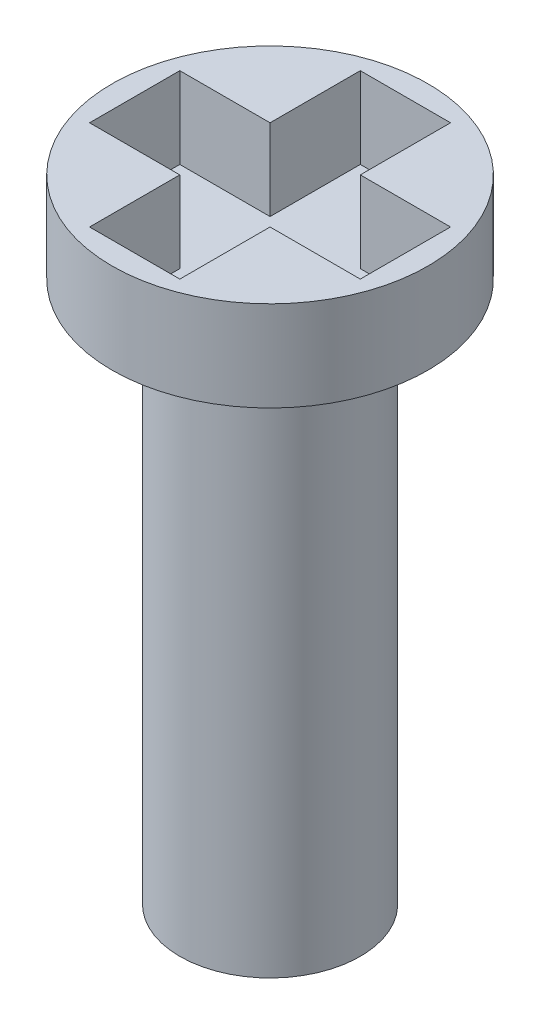
ISO-10303-21;
HEADER;
FILE_DESCRIPTION(('STEP AP214'),'2;1');
FILE_NAME('part.step','',(''),(''),'','','');
FILE_SCHEMA(('AUTOMOTIVE_DESIGN { 1 0 10303 214 1 1 1 1 }'));
ENDSEC;
DATA;
#1=APPLICATION_CONTEXT('core data for automotive mechanical design processes');
#2=APPLICATION_PROTOCOL_DEFINITION('international standard','automotive_design',2000,#1);
#3=PRODUCT_CONTEXT('',#1,'mechanical');
#4=PRODUCT('Part','Part','',(#3));
#5=PRODUCT_RELATED_PRODUCT_CATEGORY('part','',(#4));
#6=PRODUCT_DEFINITION_FORMATION('','',#4);
#7=PRODUCT_DEFINITION_CONTEXT('part definition',#1,'design');
#8=PRODUCT_DEFINITION('design','',#6,#7);
#9=PRODUCT_DEFINITION_SHAPE('','',#8);
#10=(LENGTH_UNIT() NAMED_UNIT(*) SI_UNIT(.MILLI.,.METRE.));
#11=(NAMED_UNIT(*) PLANE_ANGLE_UNIT() SI_UNIT($,.RADIAN.));
#12=(NAMED_UNIT(*) SI_UNIT($,.STERADIAN.) SOLID_ANGLE_UNIT());
#13=UNCERTAINTY_MEASURE_WITH_UNIT(LENGTH_MEASURE(1.E-05),#10,'distance_accuracy_value','');
#14=(GEOMETRIC_REPRESENTATION_CONTEXT(3) GLOBAL_UNCERTAINTY_ASSIGNED_CONTEXT((#13)) GLOBAL_UNIT_ASSIGNED_CONTEXT((#10,
#11,#12)) REPRESENTATION_CONTEXT('',''));
#15=CARTESIAN_POINT('',(0.,0.,0.));
#16=DIRECTION('',(0.,0.,1.));
#17=DIRECTION('',(1.,0.,0.));
#18=AXIS2_PLACEMENT_3D('',#15,#16,#17);
#19=CARTESIAN_POINT('',(0.,1.,1.5));
#20=DIRECTION('',(0.,0.,1.));
#21=DIRECTION('',(1.,0.,0.));
#22=AXIS2_PLACEMENT_3D('',#19,#20,#21);
#23=PLANE('',#22);
#24=DIRECTION('',(1.,0.,0.));
#25=VECTOR('',#24,1.);
#26=CARTESIAN_POINT('',(0.,0.1,1.5));
#27=LINE('',#26,#25);
#28=CARTESIAN_POINT('',(-0.5,0.1,1.5));
#29=VERTEX_POINT('',#28);
#30=CARTESIAN_POINT('',(0.5,0.1,1.5));
#31=VERTEX_POINT('',#30);
#32=EDGE_CURVE('E57',#29,#31,#27,.T.);
#33=ORIENTED_EDGE('',*,*,#32,.F.);
#34=DIRECTION('',(0.,-1.,0.));
#35=VECTOR('',#34,1.);
#36=CARTESIAN_POINT('',(-0.5,1.,1.5));
#37=LINE('',#36,#35);
#38=CARTESIAN_POINT('',(-0.5,1.,1.5));
#39=VERTEX_POINT('',#38);
#40=EDGE_CURVE('E44',#39,#29,#37,.T.);
#41=ORIENTED_EDGE('',*,*,#40,.F.);
#42=DIRECTION('',(-1.,0.,0.));
#43=VECTOR('',#42,1.);
#44=CARTESIAN_POINT('',(0.,1.,1.5));
#45=LINE('',#44,#43);
#46=CARTESIAN_POINT('',(0.5,1.,1.5));
#47=VERTEX_POINT('',#46);
#48=EDGE_CURVE('E204',#47,#39,#45,.T.);
#49=ORIENTED_EDGE('',*,*,#48,.F.);
#50=DIRECTION('',(0.,-1.,0.));
#51=VECTOR('',#50,1.);
#52=CARTESIAN_POINT('',(0.5,1.,1.5));
#53=LINE('',#52,#51);
#54=EDGE_CURVE('E64',#47,#31,#53,.T.);
#55=ORIENTED_EDGE('',*,*,#54,.T.);
#56=EDGE_LOOP('',(#33,#41,#49,#55));
#57=FACE_BOUND('',#56,.T.);
#58=ADVANCED_FACE('F41',(#57),#23,.F.);
#59=CARTESIAN_POINT('',(-0.5,1.,0.));
#60=DIRECTION('',(-1.,0.,0.));
#61=DIRECTION('',(0.,0.,1.));
#62=AXIS2_PLACEMENT_3D('',#59,#60,#61);
#63=PLANE('',#62);
#64=DIRECTION('',(0.,0.,1.));
#65=VECTOR('',#64,1.);
#66=CARTESIAN_POINT('',(-0.5,0.1,0.));
#67=LINE('',#66,#65);
#68=CARTESIAN_POINT('',(-0.5,0.1,0.5));
#69=VERTEX_POINT('',#68);
#70=EDGE_CURVE('E200',#69,#29,#67,.T.);
#71=ORIENTED_EDGE('',*,*,#70,.F.);
#72=DIRECTION('',(0.,-1.,0.));
#73=VECTOR('',#72,1.);
#74=CARTESIAN_POINT('',(-0.5,1.,0.5));
#75=LINE('',#74,#73);
#76=CARTESIAN_POINT('',(-0.5,1.,0.5));
#77=VERTEX_POINT('',#76);
#78=EDGE_CURVE('E187',#77,#69,#75,.T.);
#79=ORIENTED_EDGE('',*,*,#78,.F.);
#80=DIRECTION('',(0.,0.,-1.));
#81=VECTOR('',#80,1.);
#82=CARTESIAN_POINT('',(-0.5,1.,0.));
#83=LINE('',#82,#81);
#84=EDGE_CURVE('E201',#39,#77,#83,.T.);
#85=ORIENTED_EDGE('',*,*,#84,.F.);
#86=ORIENTED_EDGE('',*,*,#40,.T.);
#87=EDGE_LOOP('',(#71,#79,#85,#86));
#88=FACE_BOUND('',#87,.T.);
#89=ADVANCED_FACE('F199',(#88),#63,.F.);
#90=CARTESIAN_POINT('',(0.,1.,0.5));
#91=DIRECTION('',(0.,0.,-1.));
#92=DIRECTION('',(-1.,0.,0.));
#93=AXIS2_PLACEMENT_3D('',#90,#91,#92);
#94=PLANE('',#93);
#95=ORIENTED_EDGE('',*,*,#78,.T.);
#96=DIRECTION('',(-1.,0.,0.));
#97=VECTOR('',#96,1.);
#98=CARTESIAN_POINT('',(0.,0.1,0.5));
#99=LINE('',#98,#97);
#100=CARTESIAN_POINT('',(-1.5,0.1,0.5));
#101=VERTEX_POINT('',#100);
#102=EDGE_CURVE('E211',#69,#101,#99,.T.);
#103=ORIENTED_EDGE('',*,*,#102,.T.);
#104=DIRECTION('',(0.,-1.,0.));
#105=VECTOR('',#104,1.);
#106=CARTESIAN_POINT('',(-1.5,1.,0.5));
#107=LINE('',#106,#105);
#108=CARTESIAN_POINT('',(-1.5,1.,0.5));
#109=VERTEX_POINT('',#108);
#110=EDGE_CURVE('E184',#109,#101,#107,.T.);
#111=ORIENTED_EDGE('',*,*,#110,.F.);
#112=DIRECTION('',(1.,0.,0.));
#113=VECTOR('',#112,1.);
#114=CARTESIAN_POINT('',(0.,1.,0.5));
#115=LINE('',#114,#113);
#116=EDGE_CURVE('E219',#109,#77,#115,.T.);
#117=ORIENTED_EDGE('',*,*,#116,.T.);
#118=EDGE_LOOP('',(#95,#103,#111,#117));
#119=FACE_BOUND('',#118,.T.);
#120=ADVANCED_FACE('F281',(#119),#94,.T.);
#121=CARTESIAN_POINT('',(-1.5,1.,0.));
#122=DIRECTION('',(-1.,0.,0.));
#123=DIRECTION('',(0.,0.,1.));
#124=AXIS2_PLACEMENT_3D('',#121,#122,#123);
#125=PLANE('',#124);
#126=DIRECTION('',(0.,0.,1.));
#127=VECTOR('',#126,1.);
#128=CARTESIAN_POINT('',(-1.5,0.1,0.));
#129=LINE('',#128,#127);
#130=CARTESIAN_POINT('',(-1.5,0.1,-0.5));
#131=VERTEX_POINT('',#130);
#132=EDGE_CURVE('E278',#131,#101,#129,.T.);
#133=ORIENTED_EDGE('',*,*,#132,.F.);
#134=DIRECTION('',(0.,-1.,0.));
#135=VECTOR('',#134,1.);
#136=CARTESIAN_POINT('',(-1.5,1.,-0.5));
#137=LINE('',#136,#135);
#138=CARTESIAN_POINT('',(-1.5,1.,-0.5));
#139=VERTEX_POINT('',#138);
#140=EDGE_CURVE('E180',#139,#131,#137,.T.);
#141=ORIENTED_EDGE('',*,*,#140,.F.);
#142=DIRECTION('',(0.,0.,-1.));
#143=VECTOR('',#142,1.);
#144=CARTESIAN_POINT('',(-1.5,1.,0.));
#145=LINE('',#144,#143);
#146=EDGE_CURVE('E223',#109,#139,#145,.T.);
#147=ORIENTED_EDGE('',*,*,#146,.F.);
#148=ORIENTED_EDGE('',*,*,#110,.T.);
#149=EDGE_LOOP('',(#133,#141,#147,#148));
#150=FACE_BOUND('',#149,.T.);
#151=ADVANCED_FACE('F285',(#150),#125,.F.);
#152=CARTESIAN_POINT('',(0.,1.,-0.5));
#153=DIRECTION('',(0.,0.,-1.));
#154=DIRECTION('',(-1.,0.,0.));
#155=AXIS2_PLACEMENT_3D('',#152,#153,#154);
#156=PLANE('',#155);
#157=DIRECTION('',(-1.,0.,0.));
#158=VECTOR('',#157,1.);
#159=CARTESIAN_POINT('',(0.,0.1,-0.5));
#160=LINE('',#159,#158);
#161=CARTESIAN_POINT('',(-0.5,0.1,-0.5));
#162=VERTEX_POINT('',#161);
#163=EDGE_CURVE('E275',#162,#131,#160,.T.);
#164=ORIENTED_EDGE('',*,*,#163,.F.);
#165=DIRECTION('',(0.,-1.,0.));
#166=VECTOR('',#165,1.);
#167=CARTESIAN_POINT('',(-0.5,1.,-0.5));
#168=LINE('',#167,#166);
#169=CARTESIAN_POINT('',(-0.5,1.,-0.5));
#170=VERTEX_POINT('',#169);
#171=EDGE_CURVE('E176',#170,#162,#168,.T.);
#172=ORIENTED_EDGE('',*,*,#171,.F.);
#173=DIRECTION('',(1.,0.,0.));
#174=VECTOR('',#173,1.);
#175=CARTESIAN_POINT('',(0.,1.,-0.5));
#176=LINE('',#175,#174);
#177=EDGE_CURVE('E227',#139,#170,#176,.T.);
#178=ORIENTED_EDGE('',*,*,#177,.F.);
#179=ORIENTED_EDGE('',*,*,#140,.T.);
#180=EDGE_LOOP('',(#164,#172,#178,#179));
#181=FACE_BOUND('',#180,.T.);
#182=ADVANCED_FACE('F295',(#181),#156,.F.);
#183=DIRECTION('',(0.,0.,1.));
#184=VECTOR('',#183,1.);
#185=CARTESIAN_POINT('',(-0.5,0.1,0.));
#186=LINE('',#185,#184);
#187=CARTESIAN_POINT('',(-0.5,0.1,-1.5));
#188=VERTEX_POINT('',#187);
#189=EDGE_CURVE('E272',#188,#162,#186,.T.);
#190=ORIENTED_EDGE('',*,*,#189,.F.);
#191=DIRECTION('',(0.,-1.,0.));
#192=VECTOR('',#191,1.);
#193=CARTESIAN_POINT('',(-0.5,1.,-1.5));
#194=LINE('',#193,#192);
#195=CARTESIAN_POINT('',(-0.5,1.,-1.5));
#196=VERTEX_POINT('',#195);
#197=EDGE_CURVE('E172',#196,#188,#194,.T.);
#198=ORIENTED_EDGE('',*,*,#197,.F.);
#199=EDGE_CURVE('E220',#170,#196,#83,.T.);
#200=ORIENTED_EDGE('',*,*,#199,.F.);
#201=ORIENTED_EDGE('',*,*,#171,.T.);
#202=EDGE_LOOP('',(#190,#198,#200,#201));
#203=FACE_BOUND('',#202,.T.);
#204=ADVANCED_FACE('F298',(#203),#63,.F.);
#205=CARTESIAN_POINT('',(0.,1.,-1.5));
#206=DIRECTION('',(0.,0.,1.));
#207=DIRECTION('',(1.,0.,0.));
#208=AXIS2_PLACEMENT_3D('',#205,#206,#207);
#209=PLANE('',#208);
#210=ORIENTED_EDGE('',*,*,#197,.T.);
#211=DIRECTION('',(1.,0.,0.));
#212=VECTOR('',#211,1.);
#213=CARTESIAN_POINT('',(0.,0.1,-1.5));
#214=LINE('',#213,#212);
#215=CARTESIAN_POINT('',(0.5,0.1,-1.5));
#216=VERTEX_POINT('',#215);
#217=EDGE_CURVE('E268',#188,#216,#214,.T.);
#218=ORIENTED_EDGE('',*,*,#217,.T.);
#219=DIRECTION('',(0.,-1.,0.));
#220=VECTOR('',#219,1.);
#221=CARTESIAN_POINT('',(0.5,1.,-1.5));
#222=LINE('',#221,#220);
#223=CARTESIAN_POINT('',(0.5,1.,-1.5));
#224=VERTEX_POINT('',#223);
#225=EDGE_CURVE('E168',#224,#216,#222,.T.);
#226=ORIENTED_EDGE('',*,*,#225,.F.);
#227=DIRECTION('',(-1.,0.,0.));
#228=VECTOR('',#227,1.);
#229=CARTESIAN_POINT('',(0.,1.,-1.5));
#230=LINE('',#229,#228);
#231=EDGE_CURVE('E231',#224,#196,#230,.T.);
#232=ORIENTED_EDGE('',*,*,#231,.T.);
#233=EDGE_LOOP('',(#210,#218,#226,#232));
#234=FACE_BOUND('',#233,.T.);
#235=ADVANCED_FACE('F302',(#234),#209,.T.);
#236=CARTESIAN_POINT('',(0.5,1.,0.));
#237=DIRECTION('',(-1.,0.,0.));
#238=DIRECTION('',(0.,0.,1.));
#239=AXIS2_PLACEMENT_3D('',#236,#237,#238);
#240=PLANE('',#239);
#241=ORIENTED_EDGE('',*,*,#225,.T.);
#242=DIRECTION('',(0.,0.,1.));
#243=VECTOR('',#242,1.);
#244=CARTESIAN_POINT('',(0.5,0.1,0.));
#245=LINE('',#244,#243);
#246=CARTESIAN_POINT('',(0.5,0.1,-0.5));
#247=VERTEX_POINT('',#246);
#248=EDGE_CURVE('E262',#216,#247,#245,.T.);
#249=ORIENTED_EDGE('',*,*,#248,.T.);
#250=DIRECTION('',(0.,-1.,0.));
#251=VECTOR('',#250,1.);
#252=CARTESIAN_POINT('',(0.5,1.,-0.5));
#253=LINE('',#252,#251);
#254=CARTESIAN_POINT('',(0.5,1.,-0.5));
#255=VERTEX_POINT('',#254);
#256=EDGE_CURVE('E164',#255,#247,#253,.T.);
#257=ORIENTED_EDGE('',*,*,#256,.F.);
#258=DIRECTION('',(0.,0.,-1.));
#259=VECTOR('',#258,1.);
#260=CARTESIAN_POINT('',(0.5,1.,0.));
#261=LINE('',#260,#259);
#262=EDGE_CURVE('E235',#255,#224,#261,.T.);
#263=ORIENTED_EDGE('',*,*,#262,.T.);
#264=EDGE_LOOP('',(#241,#249,#257,#263));
#265=FACE_BOUND('',#264,.T.);
#266=ADVANCED_FACE('F304',(#265),#240,.T.);
#267=DIRECTION('',(-1.,0.,0.));
#268=VECTOR('',#267,1.);
#269=CARTESIAN_POINT('',(0.,0.1,-0.5));
#270=LINE('',#269,#268);
#271=CARTESIAN_POINT('',(1.5,0.1,-0.5));
#272=VERTEX_POINT('',#271);
#273=EDGE_CURVE('E259',#272,#247,#270,.T.);
#274=ORIENTED_EDGE('',*,*,#273,.F.);
#275=DIRECTION('',(0.,-1.,0.));
#276=VECTOR('',#275,1.);
#277=CARTESIAN_POINT('',(1.5,1.,-0.5));
#278=LINE('',#277,#276);
#279=CARTESIAN_POINT('',(1.5,1.,-0.5));
#280=VERTEX_POINT('',#279);
#281=EDGE_CURVE('E155',#280,#272,#278,.T.);
#282=ORIENTED_EDGE('',*,*,#281,.F.);
#283=EDGE_CURVE('E230',#255,#280,#176,.T.);
#284=ORIENTED_EDGE('',*,*,#283,.F.);
#285=ORIENTED_EDGE('',*,*,#256,.T.);
#286=EDGE_LOOP('',(#274,#282,#284,#285));
#287=FACE_BOUND('',#286,.T.);
#288=ADVANCED_FACE('F306',(#287),#156,.F.);
#289=CARTESIAN_POINT('',(1.5,1.,0.));
#290=DIRECTION('',(-1.,0.,0.));
#291=DIRECTION('',(0.,0.,1.));
#292=AXIS2_PLACEMENT_3D('',#289,#290,#291);
#293=PLANE('',#292);
#294=ORIENTED_EDGE('',*,*,#281,.T.);
#295=DIRECTION('',(0.,0.,1.));
#296=VECTOR('',#295,1.);
#297=CARTESIAN_POINT('',(1.5,0.1,0.));
#298=LINE('',#297,#296);
#299=CARTESIAN_POINT('',(1.5,0.1,0.5));
#300=VERTEX_POINT('',#299);
#301=EDGE_CURVE('E146',#272,#300,#298,.T.);
#302=ORIENTED_EDGE('',*,*,#301,.T.);
#303=DIRECTION('',(0.,-1.,0.));
#304=VECTOR('',#303,1.);
#305=CARTESIAN_POINT('',(1.5,1.,0.5));
#306=LINE('',#305,#304);
#307=CARTESIAN_POINT('',(1.5,1.,0.5));
#308=VERTEX_POINT('',#307);
#309=EDGE_CURVE('E144',#308,#300,#306,.T.);
#310=ORIENTED_EDGE('',*,*,#309,.F.);
#311=DIRECTION('',(0.,0.,-1.));
#312=VECTOR('',#311,1.);
#313=CARTESIAN_POINT('',(1.5,1.,0.));
#314=LINE('',#313,#312);
#315=EDGE_CURVE('E239',#308,#280,#314,.T.);
#316=ORIENTED_EDGE('',*,*,#315,.T.);
#317=EDGE_LOOP('',(#294,#302,#310,#316));
#318=FACE_BOUND('',#317,.T.);
#319=ADVANCED_FACE('F256',(#318),#293,.T.);
#320=ORIENTED_EDGE('',*,*,#309,.T.);
#321=DIRECTION('',(-1.,0.,0.));
#322=VECTOR('',#321,1.);
#323=CARTESIAN_POINT('',(0.,0.1,0.5));
#324=LINE('',#323,#322);
#325=CARTESIAN_POINT('',(0.5,0.1,0.5));
#326=VERTEX_POINT('',#325);
#327=EDGE_CURVE('E132',#300,#326,#324,.T.);
#328=ORIENTED_EDGE('',*,*,#327,.T.);
#329=DIRECTION('',(0.,-1.,0.));
#330=VECTOR('',#329,1.);
#331=CARTESIAN_POINT('',(0.5,1.,0.5));
#332=LINE('',#331,#330);
#333=CARTESIAN_POINT('',(0.5,1.,0.5));
#334=VERTEX_POINT('',#333);
#335=EDGE_CURVE('E142',#334,#326,#332,.T.);
#336=ORIENTED_EDGE('',*,*,#335,.F.);
#337=EDGE_CURVE('E224',#334,#308,#115,.T.);
#338=ORIENTED_EDGE('',*,*,#337,.T.);
#339=EDGE_LOOP('',(#320,#328,#336,#338));
#340=FACE_BOUND('',#339,.T.);
#341=ADVANCED_FACE('F140',(#340),#94,.T.);
#342=ORIENTED_EDGE('',*,*,#335,.T.);
#343=DIRECTION('',(0.,0.,1.));
#344=VECTOR('',#343,1.);
#345=CARTESIAN_POINT('',(0.5,0.1,0.));
#346=LINE('',#345,#344);
#347=EDGE_CURVE('E129',#326,#31,#346,.T.);
#348=ORIENTED_EDGE('',*,*,#347,.T.);
#349=ORIENTED_EDGE('',*,*,#54,.F.);
#350=EDGE_CURVE('E150',#47,#334,#261,.T.);
#351=ORIENTED_EDGE('',*,*,#350,.T.);
#352=EDGE_LOOP('',(#342,#348,#349,#351));
#353=FACE_BOUND('',#352,.T.);
#354=ADVANCED_FACE('F148',(#353),#240,.T.);
#355=CARTESIAN_POINT('',(0.,1.,0.));
#356=DIRECTION('',(0.,-1.,0.));
#357=DIRECTION('',(0.,0.,-1.));
#358=AXIS2_PLACEMENT_3D('',#355,#356,#357);
#359=CYLINDRICAL_SURFACE('',#358,1.75);
#360=CARTESIAN_POINT('',(0.,0.,0.));
#361=DIRECTION('',(0.,1.,0.));
#362=DIRECTION('',(0.,0.,1.));
#363=AXIS2_PLACEMENT_3D('',#360,#361,#362);
#364=CIRCLE('',#363,1.75);
#365=CARTESIAN_POINT('',(0.,0.,1.75));
#366=VERTEX_POINT('',#365);
#367=EDGE_CURVE('E206',#366,#366,#364,.T.);
#368=ORIENTED_EDGE('',*,*,#367,.T.);
#369=EDGE_LOOP('',(#368));
#370=FACE_BOUND('',#369,.T.);
#371=CARTESIAN_POINT('',(0.,1.,0.));
#372=DIRECTION('',(0.,1.,0.));
#373=DIRECTION('',(0.,0.,1.));
#374=AXIS2_PLACEMENT_3D('',#371,#372,#373);
#375=CIRCLE('',#374,1.75);
#376=CARTESIAN_POINT('',(0.,1.,1.75));
#377=VERTEX_POINT('',#376);
#378=EDGE_CURVE('E157',#377,#377,#375,.T.);
#379=ORIENTED_EDGE('',*,*,#378,.F.);
#380=EDGE_LOOP('',(#379));
#381=FACE_BOUND('',#380,.T.);
#382=ADVANCED_FACE('F362',(#370,#381),#359,.T.);
#383=CARTESIAN_POINT('',(0.,1.,0.));
#384=DIRECTION('',(0.,1.,0.));
#385=DIRECTION('',(0.,0.,1.));
#386=AXIS2_PLACEMENT_3D('',#383,#384,#385);
#387=PLANE('',#386);
#388=ORIENTED_EDGE('',*,*,#48,.T.);
#389=ORIENTED_EDGE('',*,*,#84,.T.);
#390=ORIENTED_EDGE('',*,*,#116,.F.);
#391=ORIENTED_EDGE('',*,*,#146,.T.);
#392=ORIENTED_EDGE('',*,*,#177,.T.);
#393=ORIENTED_EDGE('',*,*,#199,.T.);
#394=ORIENTED_EDGE('',*,*,#231,.F.);
#395=ORIENTED_EDGE('',*,*,#262,.F.);
#396=ORIENTED_EDGE('',*,*,#283,.T.);
#397=ORIENTED_EDGE('',*,*,#315,.F.);
#398=ORIENTED_EDGE('',*,*,#337,.F.);
#399=ORIENTED_EDGE('',*,*,#350,.F.);
#400=EDGE_LOOP('',(#388,#389,#390,#391,#392,#393,#394,#395,#396,#397,#398,#399));
#401=FACE_BOUND('',#400,.T.);
#402=ORIENTED_EDGE('',*,*,#378,.T.);
#403=EDGE_LOOP('',(#402));
#404=FACE_BOUND('',#403,.T.);
#405=ADVANCED_FACE('F251',(#401,#404),#387,.T.);
#406=CARTESIAN_POINT('',(0.,0.,0.));
#407=DIRECTION('',(0.,1.,0.));
#408=DIRECTION('',(0.,0.,1.));
#409=AXIS2_PLACEMENT_3D('',#406,#407,#408);
#410=PLANE('',#409);
#411=CARTESIAN_POINT('',(0.,0.,0.));
#412=DIRECTION('',(0.,-1.,0.));
#413=DIRECTION('',(0.,0.,-1.));
#414=AXIS2_PLACEMENT_3D('',#411,#412,#413);
#415=CIRCLE('',#414,1.);
#416=CARTESIAN_POINT('',(0.,0.,-1.));
#417=VERTEX_POINT('',#416);
#418=EDGE_CURVE('E11',#417,#417,#415,.T.);
#419=ORIENTED_EDGE('',*,*,#418,.F.);
#420=EDGE_LOOP('',(#419));
#421=FACE_BOUND('',#420,.T.);
#422=ORIENTED_EDGE('',*,*,#367,.F.);
#423=EDGE_LOOP('',(#422));
#424=FACE_BOUND('',#423,.T.);
#425=ADVANCED_FACE('F383',(#421,#424),#410,.F.);
#426=CARTESIAN_POINT('',(0.,0.1,0.));
#427=DIRECTION('',(0.,-1.,0.));
#428=DIRECTION('',(0.,0.,-1.));
#429=AXIS2_PLACEMENT_3D('',#426,#427,#428);
#430=PLANE('',#429);
#431=ORIENTED_EDGE('',*,*,#70,.T.);
#432=ORIENTED_EDGE('',*,*,#32,.T.);
#433=ORIENTED_EDGE('',*,*,#347,.F.);
#434=ORIENTED_EDGE('',*,*,#327,.F.);
#435=ORIENTED_EDGE('',*,*,#301,.F.);
#436=ORIENTED_EDGE('',*,*,#273,.T.);
#437=ORIENTED_EDGE('',*,*,#248,.F.);
#438=ORIENTED_EDGE('',*,*,#217,.F.);
#439=ORIENTED_EDGE('',*,*,#189,.T.);
#440=ORIENTED_EDGE('',*,*,#163,.T.);
#441=ORIENTED_EDGE('',*,*,#132,.T.);
#442=ORIENTED_EDGE('',*,*,#102,.F.);
#443=EDGE_LOOP('',(#431,#432,#433,#434,#435,#436,#437,#438,#439,#440,#441,#442));
#444=FACE_BOUND('',#443,.T.);
#445=ADVANCED_FACE('F131',(#444),#430,.F.);
#446=CARTESIAN_POINT('',(0.,-6.,0.));
#447=DIRECTION('',(0.,1.,0.));
#448=DIRECTION('',(0.,0.,1.));
#449=AXIS2_PLACEMENT_3D('',#446,#447,#448);
#450=CYLINDRICAL_SURFACE('',#449,1.);
#451=CARTESIAN_POINT('',(0.,-6.,0.));
#452=DIRECTION('',(0.,-1.,0.));
#453=DIRECTION('',(0.,0.,-1.));
#454=AXIS2_PLACEMENT_3D('',#451,#452,#453);
#455=CIRCLE('',#454,1.);
#456=CARTESIAN_POINT('',(0.,-6.,-1.));
#457=VERTEX_POINT('',#456);
#458=EDGE_CURVE('E136',#457,#457,#455,.T.);
#459=ORIENTED_EDGE('',*,*,#458,.F.);
#460=EDGE_LOOP('',(#459));
#461=FACE_BOUND('',#460,.T.);
#462=ORIENTED_EDGE('',*,*,#418,.T.);
#463=EDGE_LOOP('',(#462));
#464=FACE_BOUND('',#463,.T.);
#465=ADVANCED_FACE('F382',(#461,#464),#450,.T.);
#466=CARTESIAN_POINT('',(0.,-6.,0.));
#467=DIRECTION('',(0.,-1.,0.));
#468=DIRECTION('',(0.,0.,-1.));
#469=AXIS2_PLACEMENT_3D('',#466,#467,#468);
#470=PLANE('',#469);
#471=ORIENTED_EDGE('',*,*,#458,.T.);
#472=EDGE_LOOP('',(#471));
#473=FACE_BOUND('',#472,.T.);
#474=ADVANCED_FACE('F402',(#473),#470,.T.);
#475=CLOSED_SHELL('',(#58,#89,#120,#151,#182,#204,#235,#266,#288,#319,#341,#354,#382,#405,#425,
#445,#465,#474));
#476=MANIFOLD_SOLID_BREP('B2',#475);
#477=ADVANCED_BREP_SHAPE_REPRESENTATION('',(#18,#476),#14);
#478=SHAPE_DEFINITION_REPRESENTATION(#9,#477);
ENDSEC;
END-ISO-10303-21;
